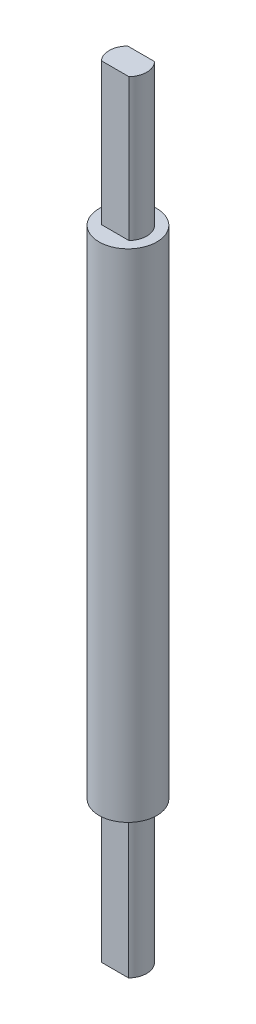
ISO-10303-21;
HEADER;
FILE_DESCRIPTION(('STEP AP214'),'2;1');
FILE_NAME('part.step','',(''),(''),'','','');
FILE_SCHEMA(('AUTOMOTIVE_DESIGN { 1 0 10303 214 1 1 1 1 }'));
ENDSEC;
DATA;
#1=APPLICATION_CONTEXT('core data for automotive mechanical design processes');
#2=APPLICATION_PROTOCOL_DEFINITION('international standard','automotive_design',2000,#1);
#3=PRODUCT_CONTEXT('',#1,'mechanical');
#4=PRODUCT('Part','Part','',(#3));
#5=PRODUCT_RELATED_PRODUCT_CATEGORY('part','',(#4));
#6=PRODUCT_DEFINITION_FORMATION('','',#4);
#7=PRODUCT_DEFINITION_CONTEXT('part definition',#1,'design');
#8=PRODUCT_DEFINITION('design','',#6,#7);
#9=PRODUCT_DEFINITION_SHAPE('','',#8);
#10=(LENGTH_UNIT() NAMED_UNIT(*) SI_UNIT(.MILLI.,.METRE.));
#11=(NAMED_UNIT(*) PLANE_ANGLE_UNIT() SI_UNIT($,.RADIAN.));
#12=(NAMED_UNIT(*) SI_UNIT($,.STERADIAN.) SOLID_ANGLE_UNIT());
#13=UNCERTAINTY_MEASURE_WITH_UNIT(LENGTH_MEASURE(1.E-05),#10,'distance_accuracy_value','');
#14=(GEOMETRIC_REPRESENTATION_CONTEXT(3) GLOBAL_UNCERTAINTY_ASSIGNED_CONTEXT((#13)) GLOBAL_UNIT_ASSIGNED_CONTEXT((#10,
#11,#12)) REPRESENTATION_CONTEXT('',''));
#15=CARTESIAN_POINT('',(0.,0.,0.));
#16=DIRECTION('',(0.,0.,1.));
#17=DIRECTION('',(1.,0.,0.));
#18=AXIS2_PLACEMENT_3D('',#15,#16,#17);
#19=CARTESIAN_POINT('',(0.,20.,0.));
#20=DIRECTION('',(0.,-1.,0.));
#21=DIRECTION('',(0.,0.,-1.));
#22=AXIS2_PLACEMENT_3D('',#19,#20,#21);
#23=CYLINDRICAL_SURFACE('',#22,2.64);
#24=CARTESIAN_POINT('',(0.,0.,0.));
#25=DIRECTION('',(0.,1.,0.));
#26=DIRECTION('',(0.,0.,1.));
#27=AXIS2_PLACEMENT_3D('',#24,#25,#26);
#28=CIRCLE('',#27,2.64);
#29=CARTESIAN_POINT('',(1.9076097609312,0.,1.825));
#30=VERTEX_POINT('',#29);
#31=CARTESIAN_POINT('',(1.9076097609312,0.,-1.825));
#32=VERTEX_POINT('',#31);
#33=EDGE_CURVE('E131',#30,#32,#28,.T.);
#34=ORIENTED_EDGE('',*,*,#33,.T.);
#35=DIRECTION('',(0.,-1.,0.));
#36=VECTOR('',#35,1.);
#37=CARTESIAN_POINT('',(1.9076097609312,20.,-1.825));
#38=LINE('',#37,#36);
#39=CARTESIAN_POINT('',(1.9076097609312,20.,-1.825));
#40=VERTEX_POINT('',#39);
#41=EDGE_CURVE('E11',#40,#32,#38,.T.);
#42=ORIENTED_EDGE('',*,*,#41,.F.);
#43=CARTESIAN_POINT('',(0.,20.,0.));
#44=DIRECTION('',(0.,1.,0.));
#45=DIRECTION('',(0.,0.,1.));
#46=AXIS2_PLACEMENT_3D('',#43,#44,#45);
#47=CIRCLE('',#46,2.64);
#48=CARTESIAN_POINT('',(1.9076097609312,20.,1.825));
#49=VERTEX_POINT('',#48);
#50=EDGE_CURVE('E133',#49,#40,#47,.T.);
#51=ORIENTED_EDGE('',*,*,#50,.F.);
#52=DIRECTION('',(0.,-1.,0.));
#53=VECTOR('',#52,1.);
#54=CARTESIAN_POINT('',(1.9076097609312,20.,1.825));
#55=LINE('',#54,#53);
#56=EDGE_CURVE('E146',#49,#30,#55,.T.);
#57=ORIENTED_EDGE('',*,*,#56,.T.);
#58=EDGE_LOOP('',(#34,#42,#51,#57));
#59=FACE_BOUND('',#58,.T.);
#60=ADVANCED_FACE('F37',(#59),#23,.T.);
#61=CARTESIAN_POINT('',(1.9076097609312,20.,-1.825));
#62=DIRECTION('',(0.,0.,1.));
#63=DIRECTION('',(1.,0.,0.));
#64=AXIS2_PLACEMENT_3D('',#61,#62,#63);
#65=PLANE('',#64);
#66=DIRECTION('',(-1.,0.,0.));
#67=VECTOR('',#66,1.);
#68=CARTESIAN_POINT('',(1.9076097609312,0.,-1.825));
#69=LINE('',#68,#67);
#70=CARTESIAN_POINT('',(-1.9076097609312,0.,-1.825));
#71=VERTEX_POINT('',#70);
#72=EDGE_CURVE('E149',#32,#71,#69,.T.);
#73=ORIENTED_EDGE('',*,*,#72,.T.);
#74=DIRECTION('',(0.,-1.,0.));
#75=VECTOR('',#74,1.);
#76=CARTESIAN_POINT('',(-1.9076097609312,20.,-1.825));
#77=LINE('',#76,#75);
#78=CARTESIAN_POINT('',(-1.9076097609312,20.,-1.825));
#79=VERTEX_POINT('',#78);
#80=EDGE_CURVE('E44',#79,#71,#77,.T.);
#81=ORIENTED_EDGE('',*,*,#80,.F.);
#82=DIRECTION('',(-1.,0.,0.));
#83=VECTOR('',#82,1.);
#84=CARTESIAN_POINT('',(1.9076097609312,20.,-1.825));
#85=LINE('',#84,#83);
#86=EDGE_CURVE('E136',#40,#79,#85,.T.);
#87=ORIENTED_EDGE('',*,*,#86,.F.);
#88=ORIENTED_EDGE('',*,*,#41,.T.);
#89=EDGE_LOOP('',(#73,#81,#87,#88));
#90=FACE_BOUND('',#89,.T.);
#91=ADVANCED_FACE('F176',(#90),#65,.F.);
#92=CARTESIAN_POINT('',(0.,20.,0.));
#93=DIRECTION('',(0.,-1.,0.));
#94=DIRECTION('',(0.,0.,-1.));
#95=AXIS2_PLACEMENT_3D('',#92,#93,#94);
#96=CYLINDRICAL_SURFACE('',#95,2.64);
#97=CARTESIAN_POINT('',(0.,0.,0.));
#98=DIRECTION('',(0.,1.,0.));
#99=DIRECTION('',(0.,0.,1.));
#100=AXIS2_PLACEMENT_3D('',#97,#98,#99);
#101=CIRCLE('',#100,2.64);
#102=CARTESIAN_POINT('',(-1.9076097609312,0.,1.825));
#103=VERTEX_POINT('',#102);
#104=EDGE_CURVE('E151',#71,#103,#101,.T.);
#105=ORIENTED_EDGE('',*,*,#104,.T.);
#106=DIRECTION('',(0.,-1.,0.));
#107=VECTOR('',#106,1.);
#108=CARTESIAN_POINT('',(-1.9076097609312,20.,1.825));
#109=LINE('',#108,#107);
#110=CARTESIAN_POINT('',(-1.9076097609312,20.,1.825));
#111=VERTEX_POINT('',#110);
#112=EDGE_CURVE('E156',#111,#103,#109,.T.);
#113=ORIENTED_EDGE('',*,*,#112,.F.);
#114=CARTESIAN_POINT('',(0.,20.,0.));
#115=DIRECTION('',(0.,1.,0.));
#116=DIRECTION('',(0.,0.,1.));
#117=AXIS2_PLACEMENT_3D('',#114,#115,#116);
#118=CIRCLE('',#117,2.64);
#119=EDGE_CURVE('E140',#79,#111,#118,.T.);
#120=ORIENTED_EDGE('',*,*,#119,.F.);
#121=ORIENTED_EDGE('',*,*,#80,.T.);
#122=EDGE_LOOP('',(#105,#113,#120,#121));
#123=FACE_BOUND('',#122,.T.);
#124=ADVANCED_FACE('F162',(#123),#96,.T.);
#125=CARTESIAN_POINT('',(-1.9076097609312,20.,1.825));
#126=DIRECTION('',(0.,0.,-1.));
#127=DIRECTION('',(-1.,0.,0.));
#128=AXIS2_PLACEMENT_3D('',#125,#126,#127);
#129=PLANE('',#128);
#130=DIRECTION('',(1.,0.,0.));
#131=VECTOR('',#130,1.);
#132=CARTESIAN_POINT('',(-1.9076097609312,0.,1.825));
#133=LINE('',#132,#131);
#134=EDGE_CURVE('E137',#103,#30,#133,.T.);
#135=ORIENTED_EDGE('',*,*,#134,.T.);
#136=ORIENTED_EDGE('',*,*,#56,.F.);
#137=DIRECTION('',(1.,0.,0.));
#138=VECTOR('',#137,1.);
#139=CARTESIAN_POINT('',(-1.9076097609312,20.,1.825));
#140=LINE('',#139,#138);
#141=EDGE_CURVE('E143',#111,#49,#140,.T.);
#142=ORIENTED_EDGE('',*,*,#141,.F.);
#143=ORIENTED_EDGE('',*,*,#112,.T.);
#144=EDGE_LOOP('',(#135,#136,#142,#143));
#145=FACE_BOUND('',#144,.T.);
#146=ADVANCED_FACE('F170',(#145),#129,.F.);
#147=CARTESIAN_POINT('',(0.,0.,0.));
#148=DIRECTION('',(0.,1.,0.));
#149=DIRECTION('',(0.,0.,1.));
#150=AXIS2_PLACEMENT_3D('',#147,#148,#149);
#151=PLANE('',#150);
#152=ORIENTED_EDGE('',*,*,#33,.F.);
#153=ORIENTED_EDGE('',*,*,#134,.F.);
#154=ORIENTED_EDGE('',*,*,#104,.F.);
#155=ORIENTED_EDGE('',*,*,#72,.F.);
#156=EDGE_LOOP('',(#152,#153,#154,#155));
#157=FACE_BOUND('',#156,.T.);
#158=ADVANCED_FACE('F167',(#157),#151,.F.);
#159=CARTESIAN_POINT('',(0.,20.,0.));
#160=DIRECTION('',(0.,1.,0.));
#161=DIRECTION('',(0.,0.,1.));
#162=AXIS2_PLACEMENT_3D('',#159,#160,#161);
#163=PLANE('',#162);
#164=CARTESIAN_POINT('',(0.,20.,0.));
#165=DIRECTION('',(0.,1.,0.));
#166=DIRECTION('',(0.,0.,1.));
#167=AXIS2_PLACEMENT_3D('',#164,#165,#166);
#168=CIRCLE('',#167,4.075);
#169=CARTESIAN_POINT('',(0.,20.,4.075));
#170=VERTEX_POINT('',#169);
#171=EDGE_CURVE('E121',#170,#170,#168,.T.);
#172=ORIENTED_EDGE('',*,*,#171,.F.);
#173=EDGE_LOOP('',(#172));
#174=FACE_BOUND('',#173,.T.);
#175=ORIENTED_EDGE('',*,*,#141,.T.);
#176=ORIENTED_EDGE('',*,*,#50,.T.);
#177=ORIENTED_EDGE('',*,*,#86,.T.);
#178=ORIENTED_EDGE('',*,*,#119,.T.);
#179=EDGE_LOOP('',(#175,#176,#177,#178));
#180=FACE_BOUND('',#179,.T.);
#181=ADVANCED_FACE('F175',(#174,#180),#163,.F.);
#182=CARTESIAN_POINT('',(0.,90.,0.));
#183=DIRECTION('',(0.,-1.,0.));
#184=DIRECTION('',(0.,0.,-1.));
#185=AXIS2_PLACEMENT_3D('',#182,#183,#184);
#186=CYLINDRICAL_SURFACE('',#185,4.075);
#187=CARTESIAN_POINT('',(0.,90.,0.));
#188=DIRECTION('',(0.,1.,0.));
#189=DIRECTION('',(0.,0.,1.));
#190=AXIS2_PLACEMENT_3D('',#187,#188,#189);
#191=CIRCLE('',#190,4.075);
#192=CARTESIAN_POINT('',(0.,90.,4.075));
#193=VERTEX_POINT('',#192);
#194=EDGE_CURVE('E124',#193,#193,#191,.T.);
#195=ORIENTED_EDGE('',*,*,#194,.F.);
#196=EDGE_LOOP('',(#195));
#197=FACE_BOUND('',#196,.T.);
#198=ORIENTED_EDGE('',*,*,#171,.T.);
#199=EDGE_LOOP('',(#198));
#200=FACE_BOUND('',#199,.T.);
#201=ADVANCED_FACE('F188',(#197,#200),#186,.T.);
#202=CARTESIAN_POINT('',(0.,90.,0.));
#203=DIRECTION('',(0.,1.,0.));
#204=DIRECTION('',(0.,0.,1.));
#205=AXIS2_PLACEMENT_3D('',#202,#203,#204);
#206=PLANE('',#205);
#207=CARTESIAN_POINT('',(0.,90.,0.));
#208=DIRECTION('',(0.,1.,0.));
#209=DIRECTION('',(0.,0.,1.));
#210=AXIS2_PLACEMENT_3D('',#207,#208,#209);
#211=CIRCLE('',#210,2.65);
#212=CARTESIAN_POINT('',(1.94486503387767,90.,1.8));
#213=VERTEX_POINT('',#212);
#214=CARTESIAN_POINT('',(1.89736659610103,90.,-1.85));
#215=VERTEX_POINT('',#214);
#216=EDGE_CURVE('E51',#213,#215,#211,.T.);
#217=ORIENTED_EDGE('',*,*,#216,.F.);
#218=DIRECTION('',(1.,0.,0.));
#219=VECTOR('',#218,1.);
#220=CARTESIAN_POINT('',(1.94486503387767,90.,1.8));
#221=LINE('',#220,#219);
#222=CARTESIAN_POINT('',(-1.94486503387767,90.,1.8));
#223=VERTEX_POINT('',#222);
#224=EDGE_CURVE('E55',#223,#213,#221,.T.);
#225=ORIENTED_EDGE('',*,*,#224,.F.);
#226=CARTESIAN_POINT('',(0.,90.,0.));
#227=DIRECTION('',(0.,1.,0.));
#228=DIRECTION('',(0.,0.,1.));
#229=AXIS2_PLACEMENT_3D('',#226,#227,#228);
#230=CIRCLE('',#229,2.65);
#231=CARTESIAN_POINT('',(-1.89736659610103,90.,-1.85));
#232=VERTEX_POINT('',#231);
#233=EDGE_CURVE('E290',#232,#223,#230,.T.);
#234=ORIENTED_EDGE('',*,*,#233,.F.);
#235=DIRECTION('',(-1.,0.,0.));
#236=VECTOR('',#235,1.);
#237=CARTESIAN_POINT('',(1.89736659610103,90.,-1.85));
#238=LINE('',#237,#236);
#239=EDGE_CURVE('E296',#215,#232,#238,.T.);
#240=ORIENTED_EDGE('',*,*,#239,.F.);
#241=EDGE_LOOP('',(#217,#225,#234,#240));
#242=FACE_BOUND('',#241,.T.);
#243=ORIENTED_EDGE('',*,*,#194,.T.);
#244=EDGE_LOOP('',(#243));
#245=FACE_BOUND('',#244,.T.);
#246=ADVANCED_FACE('F191',(#242,#245),#206,.T.);
#247=CARTESIAN_POINT('',(0.,110.,0.));
#248=DIRECTION('',(0.,-1.,0.));
#249=DIRECTION('',(0.,0.,-1.));
#250=AXIS2_PLACEMENT_3D('',#247,#248,#249);
#251=CYLINDRICAL_SURFACE('',#250,2.65);
#252=ORIENTED_EDGE('',*,*,#216,.T.);
#253=DIRECTION('',(0.,-1.,0.));
#254=VECTOR('',#253,1.);
#255=CARTESIAN_POINT('',(1.89736659610103,110.,-1.85));
#256=LINE('',#255,#254);
#257=CARTESIAN_POINT('',(1.89736659610103,110.,-1.85));
#258=VERTEX_POINT('',#257);
#259=EDGE_CURVE('E104',#258,#215,#256,.T.);
#260=ORIENTED_EDGE('',*,*,#259,.F.);
#261=CARTESIAN_POINT('',(0.,110.,0.));
#262=DIRECTION('',(0.,1.,0.));
#263=DIRECTION('',(0.,0.,1.));
#264=AXIS2_PLACEMENT_3D('',#261,#262,#263);
#265=CIRCLE('',#264,2.65);
#266=CARTESIAN_POINT('',(1.94486503387767,110.,1.8));
#267=VERTEX_POINT('',#266);
#268=EDGE_CURVE('E110',#267,#258,#265,.T.);
#269=ORIENTED_EDGE('',*,*,#268,.F.);
#270=DIRECTION('',(0.,-1.,0.));
#271=VECTOR('',#270,1.);
#272=CARTESIAN_POINT('',(1.94486503387767,110.,1.8));
#273=LINE('',#272,#271);
#274=EDGE_CURVE('E288',#267,#213,#273,.T.);
#275=ORIENTED_EDGE('',*,*,#274,.T.);
#276=EDGE_LOOP('',(#252,#260,#269,#275));
#277=FACE_BOUND('',#276,.T.);
#278=ADVANCED_FACE('F120',(#277),#251,.T.);
#279=CARTESIAN_POINT('',(1.89736659610103,110.,-1.85));
#280=DIRECTION('',(0.,0.,1.));
#281=DIRECTION('',(1.,0.,0.));
#282=AXIS2_PLACEMENT_3D('',#279,#280,#281);
#283=PLANE('',#282);
#284=ORIENTED_EDGE('',*,*,#239,.T.);
#285=DIRECTION('',(0.,-1.,0.));
#286=VECTOR('',#285,1.);
#287=CARTESIAN_POINT('',(-1.89736659610103,110.,-1.85));
#288=LINE('',#287,#286);
#289=CARTESIAN_POINT('',(-1.89736659610103,110.,-1.85));
#290=VERTEX_POINT('',#289);
#291=EDGE_CURVE('E106',#290,#232,#288,.T.);
#292=ORIENTED_EDGE('',*,*,#291,.F.);
#293=DIRECTION('',(-1.,0.,0.));
#294=VECTOR('',#293,1.);
#295=CARTESIAN_POINT('',(1.89736659610103,110.,-1.85));
#296=LINE('',#295,#294);
#297=EDGE_CURVE('E99',#258,#290,#296,.T.);
#298=ORIENTED_EDGE('',*,*,#297,.F.);
#299=ORIENTED_EDGE('',*,*,#259,.T.);
#300=EDGE_LOOP('',(#284,#292,#298,#299));
#301=FACE_BOUND('',#300,.T.);
#302=ADVANCED_FACE('F102',(#301),#283,.F.);
#303=CARTESIAN_POINT('',(0.,110.,0.));
#304=DIRECTION('',(0.,-1.,0.));
#305=DIRECTION('',(0.,0.,-1.));
#306=AXIS2_PLACEMENT_3D('',#303,#304,#305);
#307=CYLINDRICAL_SURFACE('',#306,2.65);
#308=ORIENTED_EDGE('',*,*,#233,.T.);
#309=DIRECTION('',(0.,-1.,0.));
#310=VECTOR('',#309,1.);
#311=CARTESIAN_POINT('',(-1.94486503387767,110.,1.8));
#312=LINE('',#311,#310);
#313=CARTESIAN_POINT('',(-1.94486503387767,110.,1.8));
#314=VERTEX_POINT('',#313);
#315=EDGE_CURVE('E126',#314,#223,#312,.T.);
#316=ORIENTED_EDGE('',*,*,#315,.F.);
#317=CARTESIAN_POINT('',(0.,110.,0.));
#318=DIRECTION('',(0.,1.,0.));
#319=DIRECTION('',(0.,0.,1.));
#320=AXIS2_PLACEMENT_3D('',#317,#318,#319);
#321=CIRCLE('',#320,2.65);
#322=EDGE_CURVE('E109',#290,#314,#321,.T.);
#323=ORIENTED_EDGE('',*,*,#322,.F.);
#324=ORIENTED_EDGE('',*,*,#291,.T.);
#325=EDGE_LOOP('',(#308,#316,#323,#324));
#326=FACE_BOUND('',#325,.T.);
#327=ADVANCED_FACE('F202',(#326),#307,.T.);
#328=CARTESIAN_POINT('',(1.94486503387767,110.,1.8));
#329=DIRECTION('',(0.,0.,-1.));
#330=DIRECTION('',(-1.,0.,0.));
#331=AXIS2_PLACEMENT_3D('',#328,#329,#330);
#332=PLANE('',#331);
#333=ORIENTED_EDGE('',*,*,#224,.T.);
#334=ORIENTED_EDGE('',*,*,#274,.F.);
#335=DIRECTION('',(1.,0.,0.));
#336=VECTOR('',#335,1.);
#337=CARTESIAN_POINT('',(1.94486503387767,110.,1.8));
#338=LINE('',#337,#336);
#339=EDGE_CURVE('E115',#314,#267,#338,.T.);
#340=ORIENTED_EDGE('',*,*,#339,.F.);
#341=ORIENTED_EDGE('',*,*,#315,.T.);
#342=EDGE_LOOP('',(#333,#334,#340,#341));
#343=FACE_BOUND('',#342,.T.);
#344=ADVANCED_FACE('F205',(#343),#332,.F.);
#345=CARTESIAN_POINT('',(0.,110.,0.));
#346=DIRECTION('',(0.,1.,0.));
#347=DIRECTION('',(0.,0.,1.));
#348=AXIS2_PLACEMENT_3D('',#345,#346,#347);
#349=PLANE('',#348);
#350=ORIENTED_EDGE('',*,*,#268,.T.);
#351=ORIENTED_EDGE('',*,*,#297,.T.);
#352=ORIENTED_EDGE('',*,*,#322,.T.);
#353=ORIENTED_EDGE('',*,*,#339,.T.);
#354=EDGE_LOOP('',(#350,#351,#352,#353));
#355=FACE_BOUND('',#354,.T.);
#356=ADVANCED_FACE('F113',(#355),#349,.T.);
#357=CLOSED_SHELL('',(#60,#91,#124,#146,#158,#181,#201,#246,#278,#302,#327,#344,#356));
#358=MANIFOLD_SOLID_BREP('B2',#357);
#359=ADVANCED_BREP_SHAPE_REPRESENTATION('',(#18,#358),#14);
#360=SHAPE_DEFINITION_REPRESENTATION(#9,#359);
ENDSEC;
END-ISO-10303-21;
